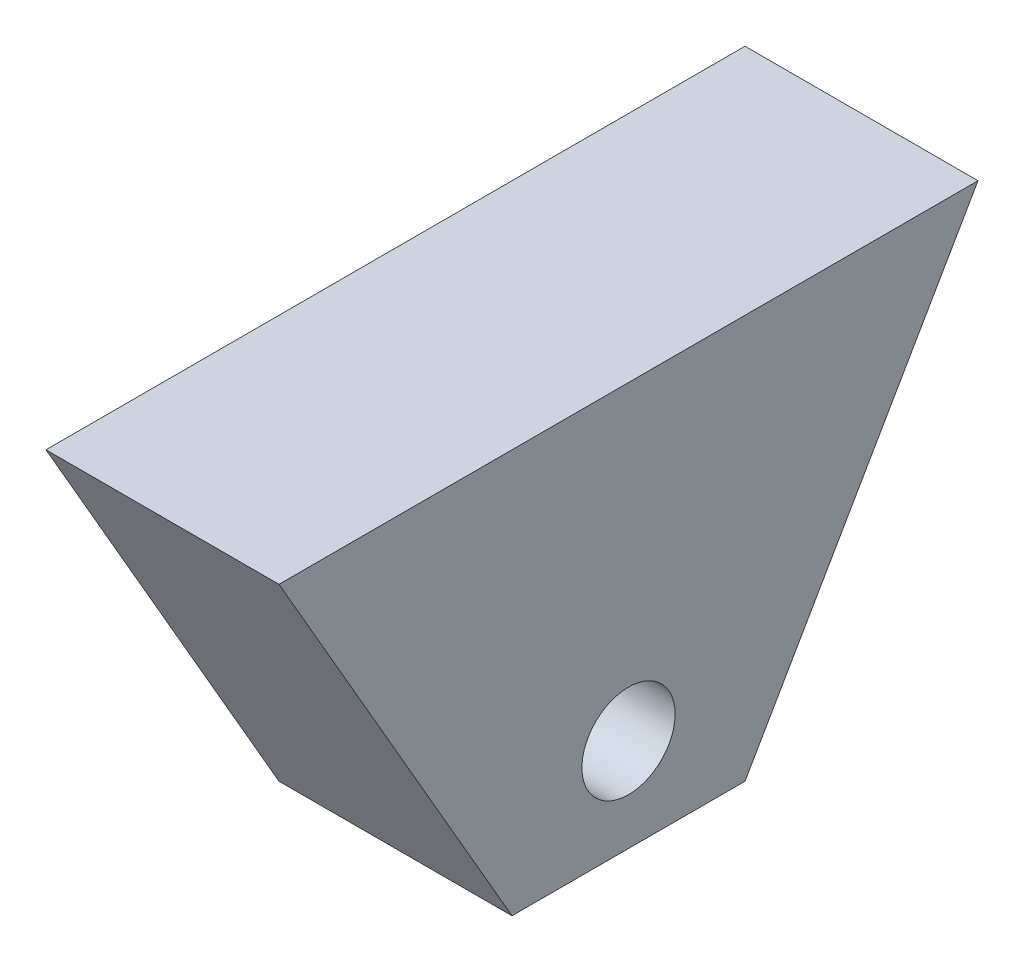
ISO-10303-21;
HEADER;
FILE_DESCRIPTION(('STEP AP214'),'2;1');
FILE_NAME('part.step','',(''),(''),'','','');
FILE_SCHEMA(('AUTOMOTIVE_DESIGN { 1 0 10303 214 1 1 1 1 }'));
ENDSEC;
DATA;
#1=APPLICATION_CONTEXT('core data for automotive mechanical design processes');
#2=APPLICATION_PROTOCOL_DEFINITION('international standard','automotive_design',2000,#1);
#3=PRODUCT_CONTEXT('',#1,'mechanical');
#4=PRODUCT('Part','Part','',(#3));
#5=PRODUCT_RELATED_PRODUCT_CATEGORY('part','',(#4));
#6=PRODUCT_DEFINITION_FORMATION('','',#4);
#7=PRODUCT_DEFINITION_CONTEXT('part definition',#1,'design');
#8=PRODUCT_DEFINITION('design','',#6,#7);
#9=PRODUCT_DEFINITION_SHAPE('','',#8);
#10=(LENGTH_UNIT() NAMED_UNIT(*) SI_UNIT(.MILLI.,.METRE.));
#11=(NAMED_UNIT(*) PLANE_ANGLE_UNIT() SI_UNIT($,.RADIAN.));
#12=(NAMED_UNIT(*) SI_UNIT($,.STERADIAN.) SOLID_ANGLE_UNIT());
#13=UNCERTAINTY_MEASURE_WITH_UNIT(LENGTH_MEASURE(1.E-05),#10,'distance_accuracy_value','');
#14=(GEOMETRIC_REPRESENTATION_CONTEXT(3) GLOBAL_UNCERTAINTY_ASSIGNED_CONTEXT((#13)) GLOBAL_UNIT_ASSIGNED_CONTEXT((#10,
#11,#12)) REPRESENTATION_CONTEXT('',''));
#15=CARTESIAN_POINT('',(0.,0.,0.));
#16=DIRECTION('',(0.,0.,1.));
#17=DIRECTION('',(1.,0.,0.));
#18=AXIS2_PLACEMENT_3D('',#15,#16,#17);
#19=CARTESIAN_POINT('',(50.,-86.6025403784427,-50.0000000000004));
#20=DIRECTION('',(0.,0.500000000000008,-0.866025403784434));
#21=DIRECTION('',(0.,0.866025403784434,0.500000000000008));
#22=AXIS2_PLACEMENT_3D('',#19,#20,#21);
#23=PLANE('',#22);
#24=DIRECTION('',(0.,-0.866025403784434,-0.500000000000009));
#25=VECTOR('',#24,1.);
#26=CARTESIAN_POINT('',(0.,-86.6025403784427,-50.0000000000004));
#27=LINE('',#26,#25);
#28=CARTESIAN_POINT('',(0.,0.,0.));
#29=VERTEX_POINT('',#28);
#30=CARTESIAN_POINT('',(0.,-86.6025403784427,-50.0000000000004));
#31=VERTEX_POINT('',#30);
#32=EDGE_CURVE('E104',#29,#31,#27,.T.);
#33=ORIENTED_EDGE('',*,*,#32,.T.);
#34=DIRECTION('',(-1.,0.,0.));
#35=VECTOR('',#34,1.);
#36=CARTESIAN_POINT('',(50.,-86.6025403784427,-50.0000000000004));
#37=LINE('',#36,#35);
#38=CARTESIAN_POINT('',(50.,-86.6025403784427,-50.0000000000004));
#39=VERTEX_POINT('',#38);
#40=EDGE_CURVE('E11',#39,#31,#37,.T.);
#41=ORIENTED_EDGE('',*,*,#40,.F.);
#42=DIRECTION('',(0.,-0.866025403784434,-0.500000000000009));
#43=VECTOR('',#42,1.);
#44=CARTESIAN_POINT('',(50.,-86.6025403784427,-50.0000000000004));
#45=LINE('',#44,#43);
#46=CARTESIAN_POINT('',(50.,0.,0.));
#47=VERTEX_POINT('',#46);
#48=EDGE_CURVE('E88',#47,#39,#45,.T.);
#49=ORIENTED_EDGE('',*,*,#48,.F.);
#50=DIRECTION('',(-1.,0.,0.));
#51=VECTOR('',#50,1.);
#52=CARTESIAN_POINT('',(50.,0.,0.));
#53=LINE('',#52,#51);
#54=EDGE_CURVE('E100',#47,#29,#53,.T.);
#55=ORIENTED_EDGE('',*,*,#54,.T.);
#56=EDGE_LOOP('',(#33,#41,#49,#55));
#57=FACE_BOUND('',#56,.T.);
#58=ADVANCED_FACE('F36',(#57),#23,.F.);
#59=CARTESIAN_POINT('',(50.,-86.6025403784429,-100.));
#60=DIRECTION('',(0.,1.,0.));
#61=DIRECTION('',(0.,0.,1.));
#62=AXIS2_PLACEMENT_3D('',#59,#60,#61);
#63=PLANE('',#62);
#64=DIRECTION('',(0.,0.,-1.));
#65=VECTOR('',#64,1.);
#66=CARTESIAN_POINT('',(0.,-86.6025403784429,-100.));
#67=LINE('',#66,#65);
#68=CARTESIAN_POINT('',(0.,-86.6025403784429,-100.));
#69=VERTEX_POINT('',#68);
#70=EDGE_CURVE('E93',#31,#69,#67,.T.);
#71=ORIENTED_EDGE('',*,*,#70,.T.);
#72=DIRECTION('',(-1.,0.,0.));
#73=VECTOR('',#72,1.);
#74=CARTESIAN_POINT('',(50.,-86.6025403784429,-100.));
#75=LINE('',#74,#73);
#76=CARTESIAN_POINT('',(50.,-86.6025403784429,-100.));
#77=VERTEX_POINT('',#76);
#78=EDGE_CURVE('E45',#77,#69,#75,.T.);
#79=ORIENTED_EDGE('',*,*,#78,.F.);
#80=DIRECTION('',(0.,0.,-1.));
#81=VECTOR('',#80,1.);
#82=CARTESIAN_POINT('',(50.,-86.6025403784429,-100.));
#83=LINE('',#82,#81);
#84=EDGE_CURVE('E83',#39,#77,#83,.T.);
#85=ORIENTED_EDGE('',*,*,#84,.F.);
#86=ORIENTED_EDGE('',*,*,#40,.T.);
#87=EDGE_LOOP('',(#71,#79,#85,#86));
#88=FACE_BOUND('',#87,.T.);
#89=ADVANCED_FACE('F92',(#88),#63,.F.);
#90=CARTESIAN_POINT('',(50.,0.,-150.));
#91=DIRECTION('',(0.,0.500000000000004,0.866025403784436));
#92=DIRECTION('',(0.,-0.866025403784436,0.500000000000004));
#93=AXIS2_PLACEMENT_3D('',#90,#91,#92);
#94=PLANE('',#93);
#95=DIRECTION('',(0.,0.866025403784436,-0.500000000000004));
#96=VECTOR('',#95,1.);
#97=CARTESIAN_POINT('',(0.,0.,-150.));
#98=LINE('',#97,#96);
#99=CARTESIAN_POINT('',(0.,0.,-150.));
#100=VERTEX_POINT('',#99);
#101=EDGE_CURVE('E70',#69,#100,#98,.T.);
#102=ORIENTED_EDGE('',*,*,#101,.T.);
#103=DIRECTION('',(-1.,0.,0.));
#104=VECTOR('',#103,1.);
#105=CARTESIAN_POINT('',(50.,0.,-150.));
#106=LINE('',#105,#104);
#107=CARTESIAN_POINT('',(50.,0.,-150.));
#108=VERTEX_POINT('',#107);
#109=EDGE_CURVE('E95',#108,#100,#106,.T.);
#110=ORIENTED_EDGE('',*,*,#109,.F.);
#111=DIRECTION('',(0.,0.866025403784436,-0.500000000000004));
#112=VECTOR('',#111,1.);
#113=CARTESIAN_POINT('',(50.,0.,-150.));
#114=LINE('',#113,#112);
#115=EDGE_CURVE('E86',#77,#108,#114,.T.);
#116=ORIENTED_EDGE('',*,*,#115,.F.);
#117=ORIENTED_EDGE('',*,*,#78,.T.);
#118=EDGE_LOOP('',(#102,#110,#116,#117));
#119=FACE_BOUND('',#118,.T.);
#120=ADVANCED_FACE('F96',(#119),#94,.F.);
#121=CARTESIAN_POINT('',(50.,0.,0.));
#122=DIRECTION('',(0.,-1.,0.));
#123=DIRECTION('',(0.,0.,-1.));
#124=AXIS2_PLACEMENT_3D('',#121,#122,#123);
#125=PLANE('',#124);
#126=DIRECTION('',(0.,0.,1.));
#127=VECTOR('',#126,1.);
#128=CARTESIAN_POINT('',(0.,0.,0.));
#129=LINE('',#128,#127);
#130=EDGE_CURVE('E76',#100,#29,#129,.T.);
#131=ORIENTED_EDGE('',*,*,#130,.T.);
#132=ORIENTED_EDGE('',*,*,#54,.F.);
#133=DIRECTION('',(0.,0.,1.));
#134=VECTOR('',#133,1.);
#135=CARTESIAN_POINT('',(50.,0.,0.));
#136=LINE('',#135,#134);
#137=EDGE_CURVE('E53',#108,#47,#136,.T.);
#138=ORIENTED_EDGE('',*,*,#137,.F.);
#139=ORIENTED_EDGE('',*,*,#109,.T.);
#140=EDGE_LOOP('',(#131,#132,#138,#139));
#141=FACE_BOUND('',#140,.T.);
#142=ADVANCED_FACE('F118',(#141),#125,.F.);
#143=CARTESIAN_POINT('',(50.,0.,0.));
#144=DIRECTION('',(-1.,0.,0.));
#145=DIRECTION('',(0.,0.,1.));
#146=AXIS2_PLACEMENT_3D('',#143,#144,#145);
#147=PLANE('',#146);
#148=CARTESIAN_POINT('',(50.,-66.6025403784427,-75.));
#149=DIRECTION('',(1.,0.,0.));
#150=DIRECTION('',(0.,0.,-1.));
#151=AXIS2_PLACEMENT_3D('',#148,#149,#150);
#152=CIRCLE('',#151,9.99999999999999);
#153=CARTESIAN_POINT('',(50.,-66.6025403784427,-85.));
#154=VERTEX_POINT('',#153);
#155=EDGE_CURVE('E125',#154,#154,#152,.T.);
#156=ORIENTED_EDGE('',*,*,#155,.F.);
#157=EDGE_LOOP('',(#156));
#158=FACE_BOUND('',#157,.T.);
#159=ORIENTED_EDGE('',*,*,#48,.T.);
#160=ORIENTED_EDGE('',*,*,#84,.T.);
#161=ORIENTED_EDGE('',*,*,#115,.T.);
#162=ORIENTED_EDGE('',*,*,#137,.T.);
#163=EDGE_LOOP('',(#159,#160,#161,#162));
#164=FACE_BOUND('',#163,.T.);
#165=ADVANCED_FACE('F84',(#158,#164),#147,.F.);
#166=CARTESIAN_POINT('',(0.,0.,0.));
#167=DIRECTION('',(-1.,0.,0.));
#168=DIRECTION('',(0.,0.,1.));
#169=AXIS2_PLACEMENT_3D('',#166,#167,#168);
#170=PLANE('',#169);
#171=CARTESIAN_POINT('',(0.,-66.6025403784427,-75.));
#172=DIRECTION('',(1.,0.,0.));
#173=DIRECTION('',(0.,0.,-1.));
#174=AXIS2_PLACEMENT_3D('',#171,#172,#173);
#175=CIRCLE('',#174,9.99999999999999);
#176=CARTESIAN_POINT('',(0.,-66.6025403784427,-85.));
#177=VERTEX_POINT('',#176);
#178=EDGE_CURVE('E108',#177,#177,#175,.T.);
#179=ORIENTED_EDGE('',*,*,#178,.T.);
#180=EDGE_LOOP('',(#179));
#181=FACE_BOUND('',#180,.T.);
#182=ORIENTED_EDGE('',*,*,#32,.F.);
#183=ORIENTED_EDGE('',*,*,#130,.F.);
#184=ORIENTED_EDGE('',*,*,#101,.F.);
#185=ORIENTED_EDGE('',*,*,#70,.F.);
#186=EDGE_LOOP('',(#182,#183,#184,#185));
#187=FACE_BOUND('',#186,.T.);
#188=ADVANCED_FACE('F121',(#181,#187),#170,.T.);
#189=CARTESIAN_POINT('',(0.,-66.6025403784427,-75.));
#190=DIRECTION('',(1.,0.,0.));
#191=DIRECTION('',(0.,0.,-1.));
#192=AXIS2_PLACEMENT_3D('',#189,#190,#191);
#193=CYLINDRICAL_SURFACE('',#192,9.99999999999999);
#194=ORIENTED_EDGE('',*,*,#178,.F.);
#195=EDGE_LOOP('',(#194));
#196=FACE_BOUND('',#195,.T.);
#197=ORIENTED_EDGE('',*,*,#155,.T.);
#198=EDGE_LOOP('',(#197));
#199=FACE_BOUND('',#198,.T.);
#200=ADVANCED_FACE('F134',(#196,#199),#193,.F.);
#201=CLOSED_SHELL('',(#58,#89,#120,#142,#165,#188,#200));
#202=MANIFOLD_SOLID_BREP('B2',#201);
#203=ADVANCED_BREP_SHAPE_REPRESENTATION('',(#18,#202),#14);
#204=SHAPE_DEFINITION_REPRESENTATION(#9,#203);
ENDSEC;
END-ISO-10303-21;
